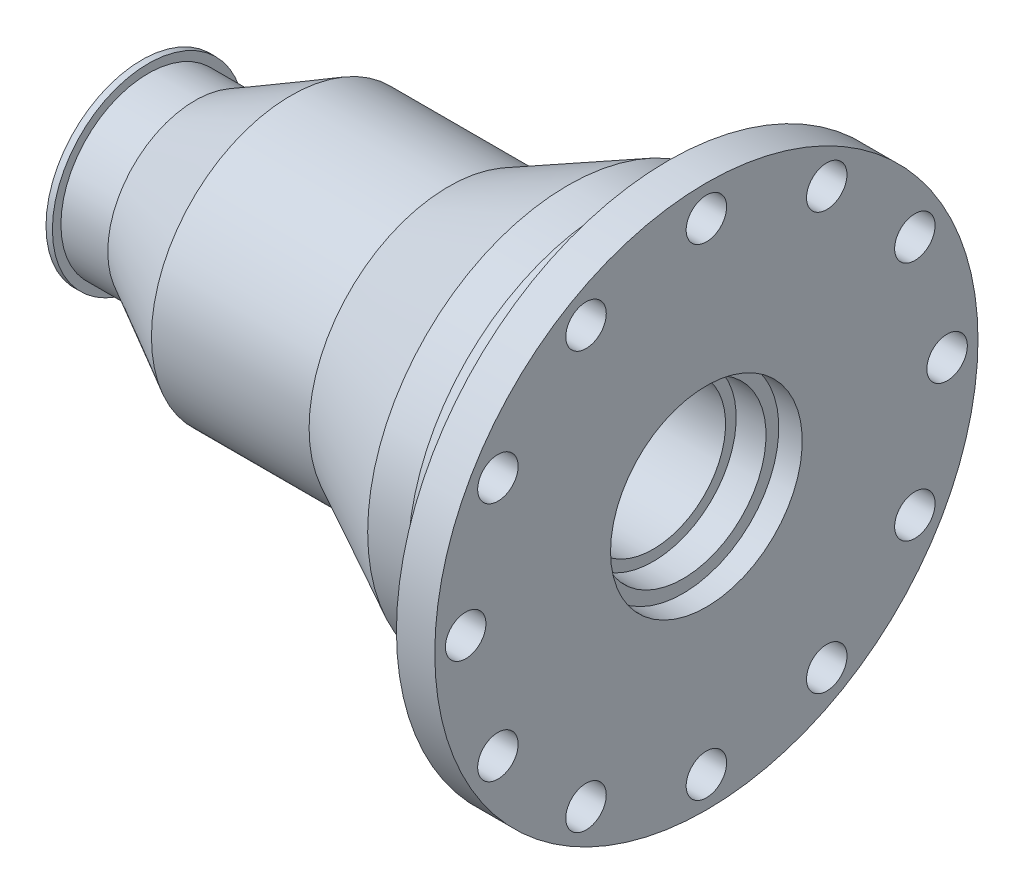
ISO-10303-21;
HEADER;
FILE_DESCRIPTION(('STEP AP214'),'2;1');
FILE_NAME('part.step','',(''),(''),'','','');
FILE_SCHEMA(('AUTOMOTIVE_DESIGN { 1 0 10303 214 1 1 1 1 }'));
ENDSEC;
DATA;
#1=APPLICATION_CONTEXT('core data for automotive mechanical design processes');
#2=APPLICATION_PROTOCOL_DEFINITION('international standard','automotive_design',2000,#1);
#3=PRODUCT_CONTEXT('',#1,'mechanical');
#4=PRODUCT('Part','Part','',(#3));
#5=PRODUCT_RELATED_PRODUCT_CATEGORY('part','',(#4));
#6=PRODUCT_DEFINITION_FORMATION('','',#4);
#7=PRODUCT_DEFINITION_CONTEXT('part definition',#1,'design');
#8=PRODUCT_DEFINITION('design','',#6,#7);
#9=PRODUCT_DEFINITION_SHAPE('','',#8);
#10=(LENGTH_UNIT() NAMED_UNIT(*) SI_UNIT(.MILLI.,.METRE.));
#11=(NAMED_UNIT(*) PLANE_ANGLE_UNIT() SI_UNIT($,.RADIAN.));
#12=(NAMED_UNIT(*) SI_UNIT($,.STERADIAN.) SOLID_ANGLE_UNIT());
#13=UNCERTAINTY_MEASURE_WITH_UNIT(LENGTH_MEASURE(1.E-05),#10,'distance_accuracy_value','');
#14=(GEOMETRIC_REPRESENTATION_CONTEXT(3) GLOBAL_UNCERTAINTY_ASSIGNED_CONTEXT((#13)) GLOBAL_UNIT_ASSIGNED_CONTEXT((#10,
#11,#12)) REPRESENTATION_CONTEXT('',''));
#15=CARTESIAN_POINT('',(0.,0.,0.));
#16=DIRECTION('',(0.,0.,1.));
#17=DIRECTION('',(1.,0.,0.));
#18=AXIS2_PLACEMENT_3D('',#15,#16,#17);
#19=CARTESIAN_POINT('',(0.,0.,0.));
#20=DIRECTION('',(1.,0.,0.));
#21=DIRECTION('',(0.,0.,-1.));
#22=AXIS2_PLACEMENT_3D('',#19,#20,#21);
#23=PLANE('',#22);
#24=CARTESIAN_POINT('',(0.,0.,0.));
#25=DIRECTION('',(-1.,0.,0.));
#26=DIRECTION('',(0.,0.,1.));
#27=AXIS2_PLACEMENT_3D('',#24,#25,#26);
#28=CIRCLE('',#27,31.);
#29=CARTESIAN_POINT('',(0.,0.,31.));
#30=VERTEX_POINT('',#29);
#31=EDGE_CURVE('E137',#30,#30,#28,.T.);
#32=ORIENTED_EDGE('',*,*,#31,.F.);
#33=EDGE_LOOP('',(#32));
#34=FACE_BOUND('',#33,.T.);
#35=CARTESIAN_POINT('',(0.,0.,0.));
#36=DIRECTION('',(-1.,0.,0.));
#37=DIRECTION('',(0.,0.,1.));
#38=AXIS2_PLACEMENT_3D('',#35,#36,#37);
#39=CIRCLE('',#38,45.);
#40=CARTESIAN_POINT('',(0.,0.,45.));
#41=VERTEX_POINT('',#40);
#42=EDGE_CURVE('E11',#41,#41,#39,.T.);
#43=ORIENTED_EDGE('',*,*,#42,.T.);
#44=EDGE_LOOP('',(#43));
#45=FACE_BOUND('',#44,.T.);
#46=ADVANCED_FACE('F50',(#34,#45),#23,.F.);
#47=CARTESIAN_POINT('',(0.,0.,0.));
#48=DIRECTION('',(-1.,0.,0.));
#49=DIRECTION('',(0.,0.,1.));
#50=AXIS2_PLACEMENT_3D('',#47,#48,#49);
#51=CYLINDRICAL_SURFACE('',#50,45.);
#52=ORIENTED_EDGE('',*,*,#42,.F.);
#53=EDGE_LOOP('',(#52));
#54=FACE_BOUND('',#53,.T.);
#55=CARTESIAN_POINT('',(3.,0.,0.));
#56=DIRECTION('',(-1.,0.,0.));
#57=DIRECTION('',(0.,0.,1.));
#58=AXIS2_PLACEMENT_3D('',#55,#56,#57);
#59=CIRCLE('',#58,45.);
#60=CARTESIAN_POINT('',(3.,0.,45.));
#61=VERTEX_POINT('',#60);
#62=EDGE_CURVE('E58',#61,#61,#59,.T.);
#63=ORIENTED_EDGE('',*,*,#62,.T.);
#64=EDGE_LOOP('',(#63));
#65=FACE_BOUND('',#64,.T.);
#66=ADVANCED_FACE('F337',(#54,#65),#51,.T.);
#67=CARTESIAN_POINT('',(3.,45.,0.));
#68=DIRECTION('',(-1.,0.,0.));
#69=DIRECTION('',(0.,0.,1.));
#70=AXIS2_PLACEMENT_3D('',#67,#68,#69);
#71=PLANE('',#70);
#72=ORIENTED_EDGE('',*,*,#62,.F.);
#73=EDGE_LOOP('',(#72));
#74=FACE_BOUND('',#73,.T.);
#75=CARTESIAN_POINT('',(3.,0.,0.));
#76=DIRECTION('',(-1.,0.,0.));
#77=DIRECTION('',(0.,0.,1.));
#78=AXIS2_PLACEMENT_3D('',#75,#76,#77);
#79=CIRCLE('',#78,41.);
#80=CARTESIAN_POINT('',(3.,0.,41.));
#81=VERTEX_POINT('',#80);
#82=EDGE_CURVE('E63',#81,#81,#79,.T.);
#83=ORIENTED_EDGE('',*,*,#82,.T.);
#84=EDGE_LOOP('',(#83));
#85=FACE_BOUND('',#84,.T.);
#86=ADVANCED_FACE('F341',(#74,#85),#71,.F.);
#87=CARTESIAN_POINT('',(0.,0.,0.));
#88=DIRECTION('',(-1.,0.,0.));
#89=DIRECTION('',(0.,0.,1.));
#90=AXIS2_PLACEMENT_3D('',#87,#88,#89);
#91=CYLINDRICAL_SURFACE('',#90,41.);
#92=ORIENTED_EDGE('',*,*,#82,.F.);
#93=EDGE_LOOP('',(#92));
#94=FACE_BOUND('',#93,.T.);
#95=CARTESIAN_POINT('',(25.,0.,0.));
#96=DIRECTION('',(-1.,0.,0.));
#97=DIRECTION('',(0.,0.,1.));
#98=AXIS2_PLACEMENT_3D('',#95,#96,#97);
#99=CIRCLE('',#98,41.);
#100=CARTESIAN_POINT('',(25.,0.,41.));
#101=VERTEX_POINT('',#100);
#102=EDGE_CURVE('E68',#101,#101,#99,.T.);
#103=ORIENTED_EDGE('',*,*,#102,.T.);
#104=EDGE_LOOP('',(#103));
#105=FACE_BOUND('',#104,.T.);
#106=ADVANCED_FACE('F416',(#94,#105),#91,.T.);
#107=CARTESIAN_POINT('',(70.,0.,0.));
#108=DIRECTION('',(1.,0.,0.));
#109=DIRECTION('',(0.,0.,-1.));
#110=AXIS2_PLACEMENT_3D('',#107,#108,#109);
#111=CONICAL_SURFACE('',#110,65.5,0.498567905638218);
#112=ORIENTED_EDGE('',*,*,#102,.F.);
#113=EDGE_LOOP('',(#112));
#114=FACE_BOUND('',#113,.T.);
#115=CARTESIAN_POINT('',(70.,0.,0.));
#116=DIRECTION('',(-1.,0.,0.));
#117=DIRECTION('',(0.,0.,1.));
#118=AXIS2_PLACEMENT_3D('',#115,#116,#117);
#119=CIRCLE('',#118,65.5);
#120=CARTESIAN_POINT('',(70.,0.,65.5));
#121=VERTEX_POINT('',#120);
#122=EDGE_CURVE('E83',#121,#121,#119,.T.);
#123=ORIENTED_EDGE('',*,*,#122,.T.);
#124=EDGE_LOOP('',(#123));
#125=FACE_BOUND('',#124,.T.);
#126=ADVANCED_FACE('F412',(#114,#125),#111,.T.);
#127=CARTESIAN_POINT('',(0.,0.,0.));
#128=DIRECTION('',(-1.,0.,0.));
#129=DIRECTION('',(0.,0.,1.));
#130=AXIS2_PLACEMENT_3D('',#127,#128,#129);
#131=CYLINDRICAL_SURFACE('',#130,65.5);
#132=ORIENTED_EDGE('',*,*,#122,.F.);
#133=EDGE_LOOP('',(#132));
#134=FACE_BOUND('',#133,.T.);
#135=CARTESIAN_POINT('',(144.,0.,0.));
#136=DIRECTION('',(-1.,0.,0.));
#137=DIRECTION('',(0.,0.,1.));
#138=AXIS2_PLACEMENT_3D('',#135,#136,#137);
#139=CIRCLE('',#138,65.5);
#140=CARTESIAN_POINT('',(144.,0.,65.5));
#141=VERTEX_POINT('',#140);
#142=EDGE_CURVE('E88',#141,#141,#139,.T.);
#143=ORIENTED_EDGE('',*,*,#142,.T.);
#144=EDGE_LOOP('',(#143));
#145=FACE_BOUND('',#144,.T.);
#146=ADVANCED_FACE('F408',(#134,#145),#131,.T.);
#147=CARTESIAN_POINT('',(200.,0.,0.));
#148=DIRECTION('',(1.,0.,0.));
#149=DIRECTION('',(0.,0.,-1.));
#150=AXIS2_PLACEMENT_3D('',#147,#148,#149);
#151=CONICAL_SURFACE('',#150,94.,0.470764926542016);
#152=ORIENTED_EDGE('',*,*,#142,.F.);
#153=EDGE_LOOP('',(#152));
#154=FACE_BOUND('',#153,.T.);
#155=CARTESIAN_POINT('',(200.,0.,0.));
#156=DIRECTION('',(-1.,0.,0.));
#157=DIRECTION('',(0.,0.,1.));
#158=AXIS2_PLACEMENT_3D('',#155,#156,#157);
#159=CIRCLE('',#158,94.);
#160=CARTESIAN_POINT('',(200.,0.,94.));
#161=VERTEX_POINT('',#160);
#162=EDGE_CURVE('E93',#161,#161,#159,.T.);
#163=ORIENTED_EDGE('',*,*,#162,.T.);
#164=EDGE_LOOP('',(#163));
#165=FACE_BOUND('',#164,.T.);
#166=ADVANCED_FACE('F404',(#154,#165),#151,.T.);
#167=CARTESIAN_POINT('',(0.,0.,0.));
#168=DIRECTION('',(-1.,0.,0.));
#169=DIRECTION('',(0.,0.,1.));
#170=AXIS2_PLACEMENT_3D('',#167,#168,#169);
#171=CYLINDRICAL_SURFACE('',#170,94.);
#172=ORIENTED_EDGE('',*,*,#162,.F.);
#173=EDGE_LOOP('',(#172));
#174=FACE_BOUND('',#173,.T.);
#175=CARTESIAN_POINT('',(220.,0.,0.));
#176=DIRECTION('',(-1.,0.,0.));
#177=DIRECTION('',(0.,0.,1.));
#178=AXIS2_PLACEMENT_3D('',#175,#176,#177);
#179=CIRCLE('',#178,94.);
#180=CARTESIAN_POINT('',(220.,0.,94.));
#181=VERTEX_POINT('',#180);
#182=EDGE_CURVE('E101',#181,#181,#179,.T.);
#183=ORIENTED_EDGE('',*,*,#182,.T.);
#184=EDGE_LOOP('',(#183));
#185=FACE_BOUND('',#184,.T.);
#186=ADVANCED_FACE('F400',(#174,#185),#171,.T.);
#187=CARTESIAN_POINT('',(220.,94.,0.));
#188=DIRECTION('',(1.,0.,0.));
#189=DIRECTION('',(0.,0.,-1.));
#190=AXIS2_PLACEMENT_3D('',#187,#188,#189);
#191=PLANE('',#190);
#192=ORIENTED_EDGE('',*,*,#182,.F.);
#193=EDGE_LOOP('',(#192));
#194=FACE_BOUND('',#193,.T.);
#195=CARTESIAN_POINT('',(220.,0.,0.));
#196=DIRECTION('',(-1.,0.,0.));
#197=DIRECTION('',(0.,0.,1.));
#198=AXIS2_PLACEMENT_3D('',#195,#196,#197);
#199=CIRCLE('',#198,95.);
#200=CARTESIAN_POINT('',(220.,0.,95.));
#201=VERTEX_POINT('',#200);
#202=EDGE_CURVE('E105',#201,#201,#199,.T.);
#203=ORIENTED_EDGE('',*,*,#202,.T.);
#204=EDGE_LOOP('',(#203));
#205=FACE_BOUND('',#204,.T.);
#206=ADVANCED_FACE('F396',(#194,#205),#191,.F.);
#207=CARTESIAN_POINT('',(0.,0.,0.));
#208=DIRECTION('',(-1.,0.,0.));
#209=DIRECTION('',(0.,0.,1.));
#210=AXIS2_PLACEMENT_3D('',#207,#208,#209);
#211=CYLINDRICAL_SURFACE('',#210,95.);
#212=ORIENTED_EDGE('',*,*,#202,.F.);
#213=EDGE_LOOP('',(#212));
#214=FACE_BOUND('',#213,.T.);
#215=CARTESIAN_POINT('',(239.,0.,0.));
#216=DIRECTION('',(-1.,0.,0.));
#217=DIRECTION('',(0.,0.,1.));
#218=AXIS2_PLACEMENT_3D('',#215,#216,#217);
#219=CIRCLE('',#218,95.);
#220=CARTESIAN_POINT('',(239.,0.,95.));
#221=VERTEX_POINT('',#220);
#222=EDGE_CURVE('E110',#221,#221,#219,.T.);
#223=ORIENTED_EDGE('',*,*,#222,.T.);
#224=EDGE_LOOP('',(#223));
#225=FACE_BOUND('',#224,.T.);
#226=ADVANCED_FACE('F389',(#214,#225),#211,.T.);
#227=CARTESIAN_POINT('',(239.,95.,0.));
#228=DIRECTION('',(1.,0.,0.));
#229=DIRECTION('',(0.,0.,-1.));
#230=AXIS2_PLACEMENT_3D('',#227,#228,#229);
#231=PLANE('',#230);
#232=ORIENTED_EDGE('',*,*,#222,.F.);
#233=EDGE_LOOP('',(#232));
#234=FACE_BOUND('',#233,.T.);
#235=CARTESIAN_POINT('',(239.,0.,0.));
#236=DIRECTION('',(-1.,0.,0.));
#237=DIRECTION('',(0.,0.,1.));
#238=AXIS2_PLACEMENT_3D('',#235,#236,#237);
#239=CIRCLE('',#238,100.);
#240=CARTESIAN_POINT('',(239.,0.,100.));
#241=VERTEX_POINT('',#240);
#242=EDGE_CURVE('E115',#241,#241,#239,.T.);
#243=ORIENTED_EDGE('',*,*,#242,.T.);
#244=EDGE_LOOP('',(#243));
#245=FACE_BOUND('',#244,.T.);
#246=ADVANCED_FACE('F384',(#234,#245),#231,.F.);
#247=CARTESIAN_POINT('',(0.,0.,0.));
#248=DIRECTION('',(-1.,0.,0.));
#249=DIRECTION('',(0.,0.,1.));
#250=AXIS2_PLACEMENT_3D('',#247,#248,#249);
#251=CYLINDRICAL_SURFACE('',#250,100.);
#252=ORIENTED_EDGE('',*,*,#242,.F.);
#253=EDGE_LOOP('',(#252));
#254=FACE_BOUND('',#253,.T.);
#255=CARTESIAN_POINT('',(247.,0.,0.));
#256=DIRECTION('',(-1.,0.,0.));
#257=DIRECTION('',(0.,0.,1.));
#258=AXIS2_PLACEMENT_3D('',#255,#256,#257);
#259=CIRCLE('',#258,100.);
#260=CARTESIAN_POINT('',(247.,0.,100.));
#261=VERTEX_POINT('',#260);
#262=EDGE_CURVE('E123',#261,#261,#259,.T.);
#263=ORIENTED_EDGE('',*,*,#262,.T.);
#264=EDGE_LOOP('',(#263));
#265=FACE_BOUND('',#264,.T.);
#266=ADVANCED_FACE('F332',(#254,#265),#251,.T.);
#267=CARTESIAN_POINT('',(247.,100.,0.));
#268=DIRECTION('',(1.,0.,0.));
#269=DIRECTION('',(0.,0.,-1.));
#270=AXIS2_PLACEMENT_3D('',#267,#268,#269);
#271=PLANE('',#270);
#272=CARTESIAN_POINT('',(247.,97.8608706276416,-56.5));
#273=DIRECTION('',(1.,0.,0.));
#274=DIRECTION('',(0.,0.,-1.));
#275=AXIS2_PLACEMENT_3D('',#272,#273,#274);
#276=CIRCLE('',#275,9.5);
#277=CARTESIAN_POINT('',(247.,97.8608706276416,-66.));
#278=VERTEX_POINT('',#277);
#279=EDGE_CURVE('E282',#278,#278,#276,.F.);
#280=ORIENTED_EDGE('',*,*,#279,.F.);
#281=EDGE_LOOP('',(#280));
#282=FACE_BOUND('',#281,.T.);
#283=CARTESIAN_POINT('',(247.,56.4999999999999,-97.8608706276416));
#284=DIRECTION('',(1.,0.,0.));
#285=DIRECTION('',(0.,0.,-1.));
#286=AXIS2_PLACEMENT_3D('',#283,#284,#285);
#287=CIRCLE('',#286,9.49999999999999);
#288=CARTESIAN_POINT('',(247.,56.4999999999999,-107.360870627642));
#289=VERTEX_POINT('',#288);
#290=EDGE_CURVE('E274',#289,#289,#287,.F.);
#291=ORIENTED_EDGE('',*,*,#290,.F.);
#292=EDGE_LOOP('',(#291));
#293=FACE_BOUND('',#292,.T.);
#294=CARTESIAN_POINT('',(247.,0.,-113.));
#295=DIRECTION('',(1.,0.,0.));
#296=DIRECTION('',(0.,0.,-1.));
#297=AXIS2_PLACEMENT_3D('',#294,#295,#296);
#298=CIRCLE('',#297,9.49999999999999);
#299=CARTESIAN_POINT('',(247.,0.,-122.5));
#300=VERTEX_POINT('',#299);
#301=EDGE_CURVE('E265',#300,#300,#298,.F.);
#302=ORIENTED_EDGE('',*,*,#301,.F.);
#303=EDGE_LOOP('',(#302));
#304=FACE_BOUND('',#303,.T.);
#305=CARTESIAN_POINT('',(247.,-56.5,-97.8608706276415));
#306=DIRECTION('',(1.,0.,0.));
#307=DIRECTION('',(0.,0.,-1.));
#308=AXIS2_PLACEMENT_3D('',#305,#306,#307);
#309=CIRCLE('',#308,9.49999999999999);
#310=CARTESIAN_POINT('',(247.,-56.5,-107.360870627642));
#311=VERTEX_POINT('',#310);
#312=EDGE_CURVE('E256',#311,#311,#309,.F.);
#313=ORIENTED_EDGE('',*,*,#312,.F.);
#314=EDGE_LOOP('',(#313));
#315=FACE_BOUND('',#314,.T.);
#316=CARTESIAN_POINT('',(247.,-97.8608706276416,-56.5));
#317=DIRECTION('',(1.,0.,0.));
#318=DIRECTION('',(0.,0.,-1.));
#319=AXIS2_PLACEMENT_3D('',#316,#317,#318);
#320=CIRCLE('',#319,9.5);
#321=CARTESIAN_POINT('',(247.,-97.8608706276416,-66.));
#322=VERTEX_POINT('',#321);
#323=EDGE_CURVE('E248',#322,#322,#320,.F.);
#324=ORIENTED_EDGE('',*,*,#323,.F.);
#325=EDGE_LOOP('',(#324));
#326=FACE_BOUND('',#325,.T.);
#327=CARTESIAN_POINT('',(247.,-113.,0.));
#328=DIRECTION('',(1.,0.,0.));
#329=DIRECTION('',(0.,0.,-1.));
#330=AXIS2_PLACEMENT_3D('',#327,#328,#329);
#331=CIRCLE('',#330,9.5);
#332=CARTESIAN_POINT('',(247.,-113.,-9.49999999999998));
#333=VERTEX_POINT('',#332);
#334=EDGE_CURVE('E237',#333,#333,#331,.F.);
#335=ORIENTED_EDGE('',*,*,#334,.F.);
#336=EDGE_LOOP('',(#335));
#337=FACE_BOUND('',#336,.T.);
#338=CARTESIAN_POINT('',(247.,-97.8608706276415,56.5));
#339=DIRECTION('',(1.,0.,0.));
#340=DIRECTION('',(0.,0.,-1.));
#341=AXIS2_PLACEMENT_3D('',#338,#339,#340);
#342=CIRCLE('',#341,9.5);
#343=CARTESIAN_POINT('',(247.,-97.8608706276415,47.));
#344=VERTEX_POINT('',#343);
#345=EDGE_CURVE('E228',#344,#344,#342,.F.);
#346=ORIENTED_EDGE('',*,*,#345,.F.);
#347=EDGE_LOOP('',(#346));
#348=FACE_BOUND('',#347,.T.);
#349=CARTESIAN_POINT('',(247.,-56.5,97.8608706276416));
#350=DIRECTION('',(1.,0.,0.));
#351=DIRECTION('',(0.,0.,-1.));
#352=AXIS2_PLACEMENT_3D('',#349,#350,#351);
#353=CIRCLE('',#352,9.49999999999999);
#354=CARTESIAN_POINT('',(247.,-56.5,88.3608706276416));
#355=VERTEX_POINT('',#354);
#356=EDGE_CURVE('E220',#355,#355,#353,.F.);
#357=ORIENTED_EDGE('',*,*,#356,.F.);
#358=EDGE_LOOP('',(#357));
#359=FACE_BOUND('',#358,.T.);
#360=CARTESIAN_POINT('',(247.,0.,113.));
#361=DIRECTION('',(1.,0.,0.));
#362=DIRECTION('',(0.,0.,-1.));
#363=AXIS2_PLACEMENT_3D('',#360,#361,#362);
#364=CIRCLE('',#363,9.49999999999999);
#365=CARTESIAN_POINT('',(247.,0.,103.5));
#366=VERTEX_POINT('',#365);
#367=EDGE_CURVE('E209',#366,#366,#364,.F.);
#368=ORIENTED_EDGE('',*,*,#367,.F.);
#369=EDGE_LOOP('',(#368));
#370=FACE_BOUND('',#369,.T.);
#371=CARTESIAN_POINT('',(247.,56.5,97.8608706276416));
#372=DIRECTION('',(1.,0.,0.));
#373=DIRECTION('',(0.,0.,-1.));
#374=AXIS2_PLACEMENT_3D('',#371,#372,#373);
#375=CIRCLE('',#374,9.49999999999999);
#376=CARTESIAN_POINT('',(247.,56.5,88.3608706276416));
#377=VERTEX_POINT('',#376);
#378=EDGE_CURVE('E200',#377,#377,#375,.F.);
#379=ORIENTED_EDGE('',*,*,#378,.F.);
#380=EDGE_LOOP('',(#379));
#381=FACE_BOUND('',#380,.T.);
#382=CARTESIAN_POINT('',(247.,97.8608706276416,56.5));
#383=DIRECTION('',(1.,0.,0.));
#384=DIRECTION('',(0.,0.,-1.));
#385=AXIS2_PLACEMENT_3D('',#382,#383,#384);
#386=CIRCLE('',#385,9.5);
#387=CARTESIAN_POINT('',(247.,97.8608706276416,47.));
#388=VERTEX_POINT('',#387);
#389=EDGE_CURVE('E192',#388,#388,#386,.F.);
#390=ORIENTED_EDGE('',*,*,#389,.F.);
#391=EDGE_LOOP('',(#390));
#392=FACE_BOUND('',#391,.T.);
#393=CARTESIAN_POINT('',(247.,113.,0.));
#394=DIRECTION('',(1.,0.,0.));
#395=DIRECTION('',(0.,0.,-1.));
#396=AXIS2_PLACEMENT_3D('',#393,#394,#395);
#397=CIRCLE('',#396,9.5);
#398=CARTESIAN_POINT('',(247.,113.,-9.50000000000001));
#399=VERTEX_POINT('',#398);
#400=EDGE_CURVE('E181',#399,#399,#397,.F.);
#401=ORIENTED_EDGE('',*,*,#400,.F.);
#402=EDGE_LOOP('',(#401));
#403=FACE_BOUND('',#402,.T.);
#404=ORIENTED_EDGE('',*,*,#262,.F.);
#405=EDGE_LOOP('',(#404));
#406=FACE_BOUND('',#405,.T.);
#407=CARTESIAN_POINT('',(247.,0.,0.));
#408=DIRECTION('',(-1.,0.,0.));
#409=DIRECTION('',(0.,0.,1.));
#410=AXIS2_PLACEMENT_3D('',#407,#408,#409);
#411=CIRCLE('',#410,127.5);
#412=CARTESIAN_POINT('',(247.,0.,127.5));
#413=VERTEX_POINT('',#412);
#414=EDGE_CURVE('E127',#413,#413,#411,.T.);
#415=ORIENTED_EDGE('',*,*,#414,.T.);
#416=EDGE_LOOP('',(#415));
#417=FACE_BOUND('',#416,.T.);
#418=ADVANCED_FACE('F327',(#282,#293,#304,#315,#326,#337,#348,#359,#370,#381,#392,#403,#406,
#417),#271,.F.);
#419=CARTESIAN_POINT('',(0.,0.,0.));
#420=DIRECTION('',(-1.,0.,0.));
#421=DIRECTION('',(0.,0.,1.));
#422=AXIS2_PLACEMENT_3D('',#419,#420,#421);
#423=CYLINDRICAL_SURFACE('',#422,127.5);
#424=ORIENTED_EDGE('',*,*,#414,.F.);
#425=EDGE_LOOP('',(#424));
#426=FACE_BOUND('',#425,.T.);
#427=CARTESIAN_POINT('',(265.,0.,0.));
#428=DIRECTION('',(-1.,0.,0.));
#429=DIRECTION('',(0.,0.,1.));
#430=AXIS2_PLACEMENT_3D('',#427,#428,#429);
#431=CIRCLE('',#430,127.5);
#432=CARTESIAN_POINT('',(265.,0.,127.5));
#433=VERTEX_POINT('',#432);
#434=EDGE_CURVE('E132',#433,#433,#431,.T.);
#435=ORIENTED_EDGE('',*,*,#434,.T.);
#436=EDGE_LOOP('',(#435));
#437=FACE_BOUND('',#436,.T.);
#438=ADVANCED_FACE('F298',(#426,#437),#423,.T.);
#439=CARTESIAN_POINT('',(265.,127.5,0.));
#440=DIRECTION('',(-1.,0.,0.));
#441=DIRECTION('',(0.,0.,1.));
#442=AXIS2_PLACEMENT_3D('',#439,#440,#441);
#443=PLANE('',#442);
#444=CARTESIAN_POINT('',(265.,97.8608706276416,-56.5));
#445=DIRECTION('',(1.,0.,0.));
#446=DIRECTION('',(0.,0.,-1.));
#447=AXIS2_PLACEMENT_3D('',#444,#445,#446);
#448=CIRCLE('',#447,9.5);
#449=CARTESIAN_POINT('',(265.,97.8608706276416,-66.));
#450=VERTEX_POINT('',#449);
#451=EDGE_CURVE('E285',#450,#450,#448,.T.);
#452=ORIENTED_EDGE('',*,*,#451,.F.);
#453=EDGE_LOOP('',(#452));
#454=FACE_BOUND('',#453,.T.);
#455=CARTESIAN_POINT('',(265.,56.4999999999999,-97.8608706276416));
#456=DIRECTION('',(1.,0.,0.));
#457=DIRECTION('',(0.,0.,-1.));
#458=AXIS2_PLACEMENT_3D('',#455,#456,#457);
#459=CIRCLE('',#458,9.49999999999999);
#460=CARTESIAN_POINT('',(265.,56.4999999999999,-107.360870627642));
#461=VERTEX_POINT('',#460);
#462=EDGE_CURVE('E277',#461,#461,#459,.T.);
#463=ORIENTED_EDGE('',*,*,#462,.F.);
#464=EDGE_LOOP('',(#463));
#465=FACE_BOUND('',#464,.T.);
#466=CARTESIAN_POINT('',(265.,0.,-113.));
#467=DIRECTION('',(1.,0.,0.));
#468=DIRECTION('',(0.,0.,-1.));
#469=AXIS2_PLACEMENT_3D('',#466,#467,#468);
#470=CIRCLE('',#469,9.49999999999999);
#471=CARTESIAN_POINT('',(265.,0.,-122.5));
#472=VERTEX_POINT('',#471);
#473=EDGE_CURVE('E269',#472,#472,#470,.T.);
#474=ORIENTED_EDGE('',*,*,#473,.F.);
#475=EDGE_LOOP('',(#474));
#476=FACE_BOUND('',#475,.T.);
#477=CARTESIAN_POINT('',(265.,-56.5,-97.8608706276415));
#478=DIRECTION('',(1.,0.,0.));
#479=DIRECTION('',(0.,0.,-1.));
#480=AXIS2_PLACEMENT_3D('',#477,#478,#479);
#481=CIRCLE('',#480,9.49999999999999);
#482=CARTESIAN_POINT('',(265.,-56.5,-107.360870627642));
#483=VERTEX_POINT('',#482);
#484=EDGE_CURVE('E260',#483,#483,#481,.T.);
#485=ORIENTED_EDGE('',*,*,#484,.F.);
#486=EDGE_LOOP('',(#485));
#487=FACE_BOUND('',#486,.T.);
#488=CARTESIAN_POINT('',(265.,-97.8608706276416,-56.5));
#489=DIRECTION('',(1.,0.,0.));
#490=DIRECTION('',(0.,0.,-1.));
#491=AXIS2_PLACEMENT_3D('',#488,#489,#490);
#492=CIRCLE('',#491,9.5);
#493=CARTESIAN_POINT('',(265.,-97.8608706276416,-66.));
#494=VERTEX_POINT('',#493);
#495=EDGE_CURVE('E251',#494,#494,#492,.T.);
#496=ORIENTED_EDGE('',*,*,#495,.F.);
#497=EDGE_LOOP('',(#496));
#498=FACE_BOUND('',#497,.T.);
#499=CARTESIAN_POINT('',(265.,-113.,0.));
#500=DIRECTION('',(1.,0.,0.));
#501=DIRECTION('',(0.,0.,-1.));
#502=AXIS2_PLACEMENT_3D('',#499,#500,#501);
#503=CIRCLE('',#502,9.5);
#504=CARTESIAN_POINT('',(265.,-113.,-9.49999999999998));
#505=VERTEX_POINT('',#504);
#506=EDGE_CURVE('E243',#505,#505,#503,.T.);
#507=ORIENTED_EDGE('',*,*,#506,.F.);
#508=EDGE_LOOP('',(#507));
#509=FACE_BOUND('',#508,.T.);
#510=CARTESIAN_POINT('',(265.,-97.8608706276415,56.5));
#511=DIRECTION('',(1.,0.,0.));
#512=DIRECTION('',(0.,0.,-1.));
#513=AXIS2_PLACEMENT_3D('',#510,#511,#512);
#514=CIRCLE('',#513,9.5);
#515=CARTESIAN_POINT('',(265.,-97.8608706276415,47.));
#516=VERTEX_POINT('',#515);
#517=EDGE_CURVE('E232',#516,#516,#514,.T.);
#518=ORIENTED_EDGE('',*,*,#517,.F.);
#519=EDGE_LOOP('',(#518));
#520=FACE_BOUND('',#519,.T.);
#521=CARTESIAN_POINT('',(265.,-56.5,97.8608706276416));
#522=DIRECTION('',(1.,0.,0.));
#523=DIRECTION('',(0.,0.,-1.));
#524=AXIS2_PLACEMENT_3D('',#521,#522,#523);
#525=CIRCLE('',#524,9.49999999999999);
#526=CARTESIAN_POINT('',(265.,-56.5,88.3608706276416));
#527=VERTEX_POINT('',#526);
#528=EDGE_CURVE('E223',#527,#527,#525,.T.);
#529=ORIENTED_EDGE('',*,*,#528,.F.);
#530=EDGE_LOOP('',(#529));
#531=FACE_BOUND('',#530,.T.);
#532=CARTESIAN_POINT('',(265.,0.,113.));
#533=DIRECTION('',(1.,0.,0.));
#534=DIRECTION('',(0.,0.,-1.));
#535=AXIS2_PLACEMENT_3D('',#532,#533,#534);
#536=CIRCLE('',#535,9.49999999999999);
#537=CARTESIAN_POINT('',(265.,0.,103.5));
#538=VERTEX_POINT('',#537);
#539=EDGE_CURVE('E215',#538,#538,#536,.T.);
#540=ORIENTED_EDGE('',*,*,#539,.F.);
#541=EDGE_LOOP('',(#540));
#542=FACE_BOUND('',#541,.T.);
#543=CARTESIAN_POINT('',(265.,56.5,97.8608706276416));
#544=DIRECTION('',(1.,0.,0.));
#545=DIRECTION('',(0.,0.,-1.));
#546=AXIS2_PLACEMENT_3D('',#543,#544,#545);
#547=CIRCLE('',#546,9.49999999999999);
#548=CARTESIAN_POINT('',(265.,56.5,88.3608706276416));
#549=VERTEX_POINT('',#548);
#550=EDGE_CURVE('E204',#549,#549,#547,.T.);
#551=ORIENTED_EDGE('',*,*,#550,.F.);
#552=EDGE_LOOP('',(#551));
#553=FACE_BOUND('',#552,.T.);
#554=CARTESIAN_POINT('',(265.,97.8608706276416,56.5));
#555=DIRECTION('',(1.,0.,0.));
#556=DIRECTION('',(0.,0.,-1.));
#557=AXIS2_PLACEMENT_3D('',#554,#555,#556);
#558=CIRCLE('',#557,9.5);
#559=CARTESIAN_POINT('',(265.,97.8608706276416,47.));
#560=VERTEX_POINT('',#559);
#561=EDGE_CURVE('E195',#560,#560,#558,.T.);
#562=ORIENTED_EDGE('',*,*,#561,.F.);
#563=EDGE_LOOP('',(#562));
#564=FACE_BOUND('',#563,.T.);
#565=CARTESIAN_POINT('',(265.,113.,0.));
#566=DIRECTION('',(1.,0.,0.));
#567=DIRECTION('',(0.,0.,-1.));
#568=AXIS2_PLACEMENT_3D('',#565,#566,#567);
#569=CIRCLE('',#568,9.5);
#570=CARTESIAN_POINT('',(265.,113.,-9.50000000000001));
#571=VERTEX_POINT('',#570);
#572=EDGE_CURVE('E187',#571,#571,#569,.T.);
#573=ORIENTED_EDGE('',*,*,#572,.F.);
#574=EDGE_LOOP('',(#573));
#575=FACE_BOUND('',#574,.T.);
#576=CARTESIAN_POINT('',(265.,0.,0.));
#577=DIRECTION('',(-1.,0.,0.));
#578=DIRECTION('',(0.,0.,1.));
#579=AXIS2_PLACEMENT_3D('',#576,#577,#578);
#580=CIRCLE('',#579,45.);
#581=CARTESIAN_POINT('',(265.,0.,45.));
#582=VERTEX_POINT('',#581);
#583=EDGE_CURVE('E176',#582,#582,#580,.T.);
#584=ORIENTED_EDGE('',*,*,#583,.T.);
#585=EDGE_LOOP('',(#584));
#586=FACE_BOUND('',#585,.T.);
#587=ORIENTED_EDGE('',*,*,#434,.F.);
#588=EDGE_LOOP('',(#587));
#589=FACE_BOUND('',#588,.T.);
#590=ADVANCED_FACE('F294',(#454,#465,#476,#487,#498,#509,#520,#531,#542,#553,#564,#575,#586,
#589),#443,.F.);
#591=CARTESIAN_POINT('',(0.,0.,0.));
#592=DIRECTION('',(-1.,0.,0.));
#593=DIRECTION('',(0.,0.,1.));
#594=AXIS2_PLACEMENT_3D('',#591,#592,#593);
#595=CYLINDRICAL_SURFACE('',#594,31.);
#596=ORIENTED_EDGE('',*,*,#31,.T.);
#597=EDGE_LOOP('',(#596));
#598=FACE_BOUND('',#597,.T.);
#599=CARTESIAN_POINT('',(203.5,0.,0.));
#600=DIRECTION('',(-1.,0.,0.));
#601=DIRECTION('',(0.,0.,1.));
#602=AXIS2_PLACEMENT_3D('',#599,#600,#601);
#603=CIRCLE('',#602,31.);
#604=CARTESIAN_POINT('',(203.5,0.,31.));
#605=VERTEX_POINT('',#604);
#606=EDGE_CURVE('E145',#605,#605,#603,.T.);
#607=ORIENTED_EDGE('',*,*,#606,.F.);
#608=EDGE_LOOP('',(#607));
#609=FACE_BOUND('',#608,.T.);
#610=ADVANCED_FACE('F297',(#598,#609),#595,.F.);
#611=CARTESIAN_POINT('',(203.5,31.,0.));
#612=DIRECTION('',(1.,0.,0.));
#613=DIRECTION('',(0.,0.,-1.));
#614=AXIS2_PLACEMENT_3D('',#611,#612,#613);
#615=PLANE('',#614);
#616=ORIENTED_EDGE('',*,*,#606,.T.);
#617=EDGE_LOOP('',(#616));
#618=FACE_BOUND('',#617,.T.);
#619=CARTESIAN_POINT('',(203.5,0.,0.));
#620=DIRECTION('',(-1.,0.,0.));
#621=DIRECTION('',(0.,0.,1.));
#622=AXIS2_PLACEMENT_3D('',#619,#620,#621);
#623=CIRCLE('',#622,34.);
#624=CARTESIAN_POINT('',(203.5,0.,34.));
#625=VERTEX_POINT('',#624);
#626=EDGE_CURVE('E149',#625,#625,#623,.T.);
#627=ORIENTED_EDGE('',*,*,#626,.F.);
#628=EDGE_LOOP('',(#627));
#629=FACE_BOUND('',#628,.T.);
#630=ADVANCED_FACE('F498',(#618,#629),#615,.T.);
#631=CARTESIAN_POINT('',(0.,0.,0.));
#632=DIRECTION('',(-1.,0.,0.));
#633=DIRECTION('',(0.,0.,1.));
#634=AXIS2_PLACEMENT_3D('',#631,#632,#633);
#635=CYLINDRICAL_SURFACE('',#634,34.);
#636=ORIENTED_EDGE('',*,*,#626,.T.);
#637=EDGE_LOOP('',(#636));
#638=FACE_BOUND('',#637,.T.);
#639=CARTESIAN_POINT('',(240.,0.,0.));
#640=DIRECTION('',(-1.,0.,0.));
#641=DIRECTION('',(0.,0.,1.));
#642=AXIS2_PLACEMENT_3D('',#639,#640,#641);
#643=CIRCLE('',#642,34.);
#644=CARTESIAN_POINT('',(240.,0.,34.));
#645=VERTEX_POINT('',#644);
#646=EDGE_CURVE('E154',#645,#645,#643,.T.);
#647=ORIENTED_EDGE('',*,*,#646,.F.);
#648=EDGE_LOOP('',(#647));
#649=FACE_BOUND('',#648,.T.);
#650=ADVANCED_FACE('F507',(#638,#649),#635,.F.);
#651=CARTESIAN_POINT('',(240.,34.,0.));
#652=DIRECTION('',(1.,0.,0.));
#653=DIRECTION('',(0.,0.,-1.));
#654=AXIS2_PLACEMENT_3D('',#651,#652,#653);
#655=PLANE('',#654);
#656=ORIENTED_EDGE('',*,*,#646,.T.);
#657=EDGE_LOOP('',(#656));
#658=FACE_BOUND('',#657,.T.);
#659=CARTESIAN_POINT('',(240.,0.,0.));
#660=DIRECTION('',(-1.,0.,0.));
#661=DIRECTION('',(0.,0.,1.));
#662=AXIS2_PLACEMENT_3D('',#659,#660,#661);
#663=CIRCLE('',#662,39.);
#664=CARTESIAN_POINT('',(240.,0.,39.));
#665=VERTEX_POINT('',#664);
#666=EDGE_CURVE('E159',#665,#665,#663,.T.);
#667=ORIENTED_EDGE('',*,*,#666,.F.);
#668=EDGE_LOOP('',(#667));
#669=FACE_BOUND('',#668,.T.);
#670=ADVANCED_FACE('F517',(#658,#669),#655,.T.);
#671=CARTESIAN_POINT('',(0.,0.,0.));
#672=DIRECTION('',(-1.,0.,0.));
#673=DIRECTION('',(0.,0.,1.));
#674=AXIS2_PLACEMENT_3D('',#671,#672,#673);
#675=CYLINDRICAL_SURFACE('',#674,39.);
#676=ORIENTED_EDGE('',*,*,#666,.T.);
#677=EDGE_LOOP('',(#676));
#678=FACE_BOUND('',#677,.T.);
#679=CARTESIAN_POINT('',(254.,0.,0.));
#680=DIRECTION('',(-1.,0.,0.));
#681=DIRECTION('',(0.,0.,1.));
#682=AXIS2_PLACEMENT_3D('',#679,#680,#681);
#683=CIRCLE('',#682,39.);
#684=CARTESIAN_POINT('',(254.,0.,39.));
#685=VERTEX_POINT('',#684);
#686=EDGE_CURVE('E167',#685,#685,#683,.T.);
#687=ORIENTED_EDGE('',*,*,#686,.F.);
#688=EDGE_LOOP('',(#687));
#689=FACE_BOUND('',#688,.T.);
#690=ADVANCED_FACE('F527',(#678,#689),#675,.F.);
#691=CARTESIAN_POINT('',(254.,39.,0.));
#692=DIRECTION('',(1.,0.,0.));
#693=DIRECTION('',(0.,0.,-1.));
#694=AXIS2_PLACEMENT_3D('',#691,#692,#693);
#695=PLANE('',#694);
#696=ORIENTED_EDGE('',*,*,#686,.T.);
#697=EDGE_LOOP('',(#696));
#698=FACE_BOUND('',#697,.T.);
#699=CARTESIAN_POINT('',(254.,0.,0.));
#700=DIRECTION('',(-1.,0.,0.));
#701=DIRECTION('',(0.,0.,1.));
#702=AXIS2_PLACEMENT_3D('',#699,#700,#701);
#703=CIRCLE('',#702,45.);
#704=CARTESIAN_POINT('',(254.,0.,45.));
#705=VERTEX_POINT('',#704);
#706=EDGE_CURVE('E171',#705,#705,#703,.T.);
#707=ORIENTED_EDGE('',*,*,#706,.F.);
#708=EDGE_LOOP('',(#707));
#709=FACE_BOUND('',#708,.T.);
#710=ADVANCED_FACE('F537',(#698,#709),#695,.T.);
#711=CARTESIAN_POINT('',(0.,0.,0.));
#712=DIRECTION('',(-1.,0.,0.));
#713=DIRECTION('',(0.,0.,1.));
#714=AXIS2_PLACEMENT_3D('',#711,#712,#713);
#715=CYLINDRICAL_SURFACE('',#714,45.);
#716=ORIENTED_EDGE('',*,*,#706,.T.);
#717=EDGE_LOOP('',(#716));
#718=FACE_BOUND('',#717,.T.);
#719=ORIENTED_EDGE('',*,*,#583,.F.);
#720=EDGE_LOOP('',(#719));
#721=FACE_BOUND('',#720,.T.);
#722=ADVANCED_FACE('F547',(#718,#721),#715,.F.);
#723=CARTESIAN_POINT('',(265.,113.,0.));
#724=DIRECTION('',(-1.,0.,0.));
#725=DIRECTION('',(0.,0.,1.));
#726=AXIS2_PLACEMENT_3D('',#723,#724,#725);
#727=CYLINDRICAL_SURFACE('',#726,9.5);
#728=ORIENTED_EDGE('',*,*,#572,.T.);
#729=EDGE_LOOP('',(#728));
#730=FACE_BOUND('',#729,.T.);
#731=ORIENTED_EDGE('',*,*,#400,.T.);
#732=EDGE_LOOP('',(#731));
#733=FACE_BOUND('',#732,.T.);
#734=ADVANCED_FACE('F557',(#730,#733),#727,.F.);
#735=CARTESIAN_POINT('',(265.,97.8608706276416,56.5));
#736=DIRECTION('',(-1.,0.,0.));
#737=DIRECTION('',(0.,0.,1.));
#738=AXIS2_PLACEMENT_3D('',#735,#736,#737);
#739=CYLINDRICAL_SURFACE('',#738,9.5);
#740=ORIENTED_EDGE('',*,*,#561,.T.);
#741=EDGE_LOOP('',(#740));
#742=FACE_BOUND('',#741,.T.);
#743=ORIENTED_EDGE('',*,*,#389,.T.);
#744=EDGE_LOOP('',(#743));
#745=FACE_BOUND('',#744,.T.);
#746=ADVANCED_FACE('F567',(#742,#745),#739,.F.);
#747=CARTESIAN_POINT('',(265.,56.5,97.8608706276416));
#748=DIRECTION('',(-1.,0.,0.));
#749=DIRECTION('',(0.,0.,1.));
#750=AXIS2_PLACEMENT_3D('',#747,#748,#749);
#751=CYLINDRICAL_SURFACE('',#750,9.49999999999999);
#752=ORIENTED_EDGE('',*,*,#550,.T.);
#753=EDGE_LOOP('',(#752));
#754=FACE_BOUND('',#753,.T.);
#755=ORIENTED_EDGE('',*,*,#378,.T.);
#756=EDGE_LOOP('',(#755));
#757=FACE_BOUND('',#756,.T.);
#758=ADVANCED_FACE('F577',(#754,#757),#751,.F.);
#759=CARTESIAN_POINT('',(265.,0.,113.));
#760=DIRECTION('',(-1.,0.,0.));
#761=DIRECTION('',(0.,0.,1.));
#762=AXIS2_PLACEMENT_3D('',#759,#760,#761);
#763=CYLINDRICAL_SURFACE('',#762,9.49999999999999);
#764=ORIENTED_EDGE('',*,*,#539,.T.);
#765=EDGE_LOOP('',(#764));
#766=FACE_BOUND('',#765,.T.);
#767=ORIENTED_EDGE('',*,*,#367,.T.);
#768=EDGE_LOOP('',(#767));
#769=FACE_BOUND('',#768,.T.);
#770=ADVANCED_FACE('F587',(#766,#769),#763,.F.);
#771=CARTESIAN_POINT('',(265.,-56.5,97.8608706276416));
#772=DIRECTION('',(-1.,0.,0.));
#773=DIRECTION('',(0.,0.,1.));
#774=AXIS2_PLACEMENT_3D('',#771,#772,#773);
#775=CYLINDRICAL_SURFACE('',#774,9.49999999999999);
#776=ORIENTED_EDGE('',*,*,#528,.T.);
#777=EDGE_LOOP('',(#776));
#778=FACE_BOUND('',#777,.T.);
#779=ORIENTED_EDGE('',*,*,#356,.T.);
#780=EDGE_LOOP('',(#779));
#781=FACE_BOUND('',#780,.T.);
#782=ADVANCED_FACE('F597',(#778,#781),#775,.F.);
#783=CARTESIAN_POINT('',(265.,-97.8608706276415,56.5));
#784=DIRECTION('',(-1.,0.,0.));
#785=DIRECTION('',(0.,0.,1.));
#786=AXIS2_PLACEMENT_3D('',#783,#784,#785);
#787=CYLINDRICAL_SURFACE('',#786,9.5);
#788=ORIENTED_EDGE('',*,*,#517,.T.);
#789=EDGE_LOOP('',(#788));
#790=FACE_BOUND('',#789,.T.);
#791=ORIENTED_EDGE('',*,*,#345,.T.);
#792=EDGE_LOOP('',(#791));
#793=FACE_BOUND('',#792,.T.);
#794=ADVANCED_FACE('F607',(#790,#793),#787,.F.);
#795=CARTESIAN_POINT('',(265.,-113.,0.));
#796=DIRECTION('',(-1.,0.,0.));
#797=DIRECTION('',(0.,0.,1.));
#798=AXIS2_PLACEMENT_3D('',#795,#796,#797);
#799=CYLINDRICAL_SURFACE('',#798,9.5);
#800=ORIENTED_EDGE('',*,*,#506,.T.);
#801=EDGE_LOOP('',(#800));
#802=FACE_BOUND('',#801,.T.);
#803=ORIENTED_EDGE('',*,*,#334,.T.);
#804=EDGE_LOOP('',(#803));
#805=FACE_BOUND('',#804,.T.);
#806=ADVANCED_FACE('F617',(#802,#805),#799,.F.);
#807=CARTESIAN_POINT('',(265.,-97.8608706276416,-56.5));
#808=DIRECTION('',(-1.,0.,0.));
#809=DIRECTION('',(0.,0.,1.));
#810=AXIS2_PLACEMENT_3D('',#807,#808,#809);
#811=CYLINDRICAL_SURFACE('',#810,9.5);
#812=ORIENTED_EDGE('',*,*,#495,.T.);
#813=EDGE_LOOP('',(#812));
#814=FACE_BOUND('',#813,.T.);
#815=ORIENTED_EDGE('',*,*,#323,.T.);
#816=EDGE_LOOP('',(#815));
#817=FACE_BOUND('',#816,.T.);
#818=ADVANCED_FACE('F627',(#814,#817),#811,.F.);
#819=CARTESIAN_POINT('',(265.,-56.5,-97.8608706276415));
#820=DIRECTION('',(-1.,0.,0.));
#821=DIRECTION('',(0.,0.,1.));
#822=AXIS2_PLACEMENT_3D('',#819,#820,#821);
#823=CYLINDRICAL_SURFACE('',#822,9.49999999999999);
#824=ORIENTED_EDGE('',*,*,#484,.T.);
#825=EDGE_LOOP('',(#824));
#826=FACE_BOUND('',#825,.T.);
#827=ORIENTED_EDGE('',*,*,#312,.T.);
#828=EDGE_LOOP('',(#827));
#829=FACE_BOUND('',#828,.T.);
#830=ADVANCED_FACE('F637',(#826,#829),#823,.F.);
#831=CARTESIAN_POINT('',(265.,0.,-113.));
#832=DIRECTION('',(-1.,0.,0.));
#833=DIRECTION('',(0.,0.,1.));
#834=AXIS2_PLACEMENT_3D('',#831,#832,#833);
#835=CYLINDRICAL_SURFACE('',#834,9.49999999999999);
#836=ORIENTED_EDGE('',*,*,#473,.T.);
#837=EDGE_LOOP('',(#836));
#838=FACE_BOUND('',#837,.T.);
#839=ORIENTED_EDGE('',*,*,#301,.T.);
#840=EDGE_LOOP('',(#839));
#841=FACE_BOUND('',#840,.T.);
#842=ADVANCED_FACE('F359',(#838,#841),#835,.F.);
#843=CARTESIAN_POINT('',(265.,56.4999999999999,-97.8608706276416));
#844=DIRECTION('',(-1.,0.,0.));
#845=DIRECTION('',(0.,0.,1.));
#846=AXIS2_PLACEMENT_3D('',#843,#844,#845);
#847=CYLINDRICAL_SURFACE('',#846,9.49999999999999);
#848=ORIENTED_EDGE('',*,*,#462,.T.);
#849=EDGE_LOOP('',(#848));
#850=FACE_BOUND('',#849,.T.);
#851=ORIENTED_EDGE('',*,*,#290,.T.);
#852=EDGE_LOOP('',(#851));
#853=FACE_BOUND('',#852,.T.);
#854=ADVANCED_FACE('F656',(#850,#853),#847,.F.);
#855=CARTESIAN_POINT('',(265.,97.8608706276416,-56.5));
#856=DIRECTION('',(-1.,0.,0.));
#857=DIRECTION('',(0.,0.,1.));
#858=AXIS2_PLACEMENT_3D('',#855,#856,#857);
#859=CYLINDRICAL_SURFACE('',#858,9.5);
#860=ORIENTED_EDGE('',*,*,#451,.T.);
#861=EDGE_LOOP('',(#860));
#862=FACE_BOUND('',#861,.T.);
#863=ORIENTED_EDGE('',*,*,#279,.T.);
#864=EDGE_LOOP('',(#863));
#865=FACE_BOUND('',#864,.T.);
#866=ADVANCED_FACE('F291',(#862,#865),#859,.F.);
#867=CLOSED_SHELL('',(#46,#66,#86,#106,#126,#146,#166,#186,#206,#226,#246,#266,#418,#438,#590,
#610,#630,#650,#670,#690,#710,#722,#734,#746,#758,#770,#782,#794,#806,#818,#830,#842,#854,#866));
#868=MANIFOLD_SOLID_BREP('B2',#867);
#869=ADVANCED_BREP_SHAPE_REPRESENTATION('',(#18,#868),#14);
#870=SHAPE_DEFINITION_REPRESENTATION(#9,#869);
ENDSEC;
END-ISO-10303-21;
